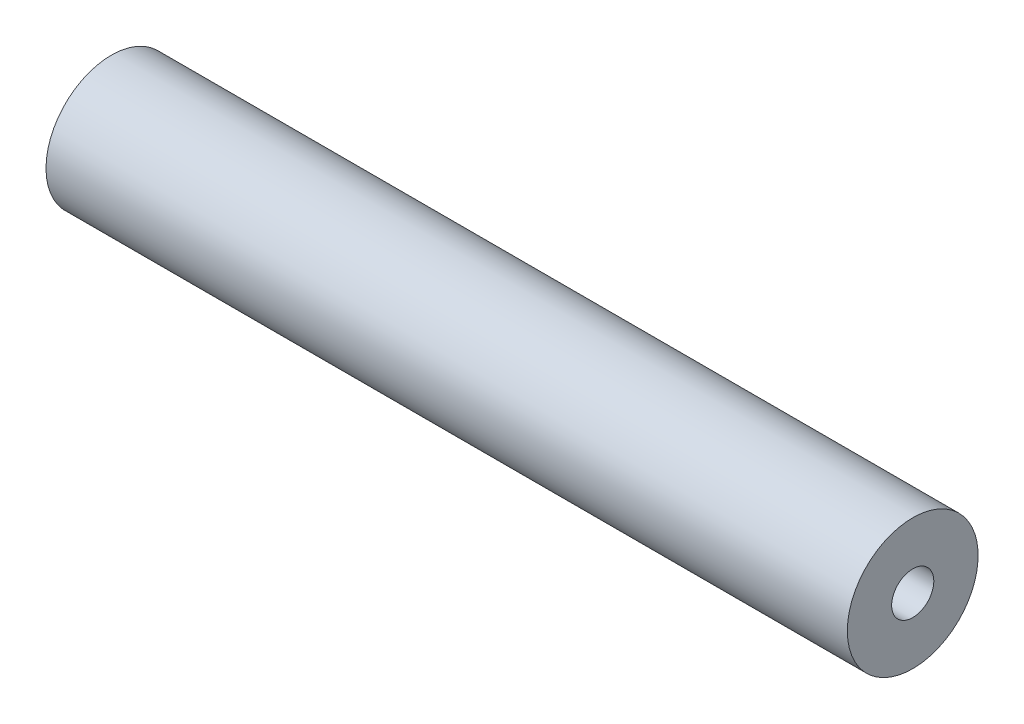
ISO-10303-21;
HEADER;
FILE_DESCRIPTION(('STEP AP214'),'2;1');
FILE_NAME('part.step','',(''),(''),'','','');
FILE_SCHEMA(('AUTOMOTIVE_DESIGN { 1 0 10303 214 1 1 1 1 }'));
ENDSEC;
DATA;
#1=APPLICATION_CONTEXT('core data for automotive mechanical design processes');
#2=APPLICATION_PROTOCOL_DEFINITION('international standard','automotive_design',2000,#1);
#3=PRODUCT_CONTEXT('',#1,'mechanical');
#4=PRODUCT('Part','Part','',(#3));
#5=PRODUCT_RELATED_PRODUCT_CATEGORY('part','',(#4));
#6=PRODUCT_DEFINITION_FORMATION('','',#4);
#7=PRODUCT_DEFINITION_CONTEXT('part definition',#1,'design');
#8=PRODUCT_DEFINITION('design','',#6,#7);
#9=PRODUCT_DEFINITION_SHAPE('','',#8);
#10=(LENGTH_UNIT() NAMED_UNIT(*) SI_UNIT(.MILLI.,.METRE.));
#11=(NAMED_UNIT(*) PLANE_ANGLE_UNIT() SI_UNIT($,.RADIAN.));
#12=(NAMED_UNIT(*) SI_UNIT($,.STERADIAN.) SOLID_ANGLE_UNIT());
#13=UNCERTAINTY_MEASURE_WITH_UNIT(LENGTH_MEASURE(1.E-05),#10,'distance_accuracy_value','');
#14=(GEOMETRIC_REPRESENTATION_CONTEXT(3) GLOBAL_UNCERTAINTY_ASSIGNED_CONTEXT((#13)) GLOBAL_UNIT_ASSIGNED_CONTEXT((#10,
#11,#12)) REPRESENTATION_CONTEXT('',''));
#15=CARTESIAN_POINT('',(0.,0.,0.));
#16=DIRECTION('',(0.,0.,1.));
#17=DIRECTION('',(1.,0.,0.));
#18=AXIS2_PLACEMENT_3D('',#15,#16,#17);
#19=CARTESIAN_POINT('',(153.,0.,0.));
#20=DIRECTION('',(-1.,0.,0.));
#21=DIRECTION('',(0.,0.,1.));
#22=AXIS2_PLACEMENT_3D('',#19,#20,#21);
#23=CYLINDRICAL_SURFACE('',#22,12.4054054054054);
#24=CARTESIAN_POINT('',(153.,0.,0.));
#25=DIRECTION('',(-1.,0.,0.));
#26=DIRECTION('',(0.,0.,1.));
#27=AXIS2_PLACEMENT_3D('',#24,#25,#26);
#28=CIRCLE('',#27,12.4054054054054);
#29=CARTESIAN_POINT('',(153.,0.,12.4054054054054));
#30=VERTEX_POINT('',#29);
#31=EDGE_CURVE('E10',#30,#30,#28,.T.);
#32=ORIENTED_EDGE('',*,*,#31,.T.);
#33=EDGE_LOOP('',(#32));
#34=FACE_BOUND('',#33,.T.);
#35=CARTESIAN_POINT('',(1.,0.,0.));
#36=DIRECTION('',(-1.,0.,0.));
#37=DIRECTION('',(0.,0.,1.));
#38=AXIS2_PLACEMENT_3D('',#35,#36,#37);
#39=CIRCLE('',#38,12.4054054054054);
#40=CARTESIAN_POINT('',(1.,0.,12.4054054054054));
#41=VERTEX_POINT('',#40);
#42=EDGE_CURVE('E46',#41,#41,#39,.T.);
#43=ORIENTED_EDGE('',*,*,#42,.F.);
#44=EDGE_LOOP('',(#43));
#45=FACE_BOUND('',#44,.T.);
#46=ADVANCED_FACE('F39',(#34,#45),#23,.T.);
#47=CARTESIAN_POINT('',(153.,12.4054054054054,0.));
#48=DIRECTION('',(1.,0.,0.));
#49=DIRECTION('',(0.,0.,-1.));
#50=AXIS2_PLACEMENT_3D('',#47,#48,#49);
#51=PLANE('',#50);
#52=CARTESIAN_POINT('',(153.,0.,0.));
#53=DIRECTION('',(1.,0.,0.));
#54=DIRECTION('',(0.,0.,-1.));
#55=AXIS2_PLACEMENT_3D('',#52,#53,#54);
#56=CIRCLE('',#55,4.);
#57=CARTESIAN_POINT('',(153.,0.,-4.));
#58=VERTEX_POINT('',#57);
#59=EDGE_CURVE('E56',#58,#58,#56,.T.);
#60=ORIENTED_EDGE('',*,*,#59,.F.);
#61=EDGE_LOOP('',(#60));
#62=FACE_BOUND('',#61,.T.);
#63=ORIENTED_EDGE('',*,*,#31,.F.);
#64=EDGE_LOOP('',(#63));
#65=FACE_BOUND('',#64,.T.);
#66=ADVANCED_FACE('F87',(#62,#65),#51,.T.);
#67=CARTESIAN_POINT('',(1.,0.,0.));
#68=DIRECTION('',(-1.,0.,0.));
#69=DIRECTION('',(0.,0.,1.));
#70=AXIS2_PLACEMENT_3D('',#67,#68,#69);
#71=PLANE('',#70);
#72=CARTESIAN_POINT('',(1.,0.,0.));
#73=DIRECTION('',(-1.,0.,0.));
#74=DIRECTION('',(0.,0.,1.));
#75=AXIS2_PLACEMENT_3D('',#72,#73,#74);
#76=CIRCLE('',#75,4.);
#77=CARTESIAN_POINT('',(1.,0.,4.));
#78=VERTEX_POINT('',#77);
#79=EDGE_CURVE('E63',#78,#78,#76,.T.);
#80=ORIENTED_EDGE('',*,*,#79,.F.);
#81=EDGE_LOOP('',(#80));
#82=FACE_BOUND('',#81,.T.);
#83=ORIENTED_EDGE('',*,*,#42,.T.);
#84=EDGE_LOOP('',(#83));
#85=FACE_BOUND('',#84,.T.);
#86=ADVANCED_FACE('F91',(#82,#85),#71,.T.);
#87=CARTESIAN_POINT('',(132.,0.,0.));
#88=DIRECTION('',(1.,0.,0.));
#89=DIRECTION('',(0.,0.,-1.));
#90=AXIS2_PLACEMENT_3D('',#87,#88,#89);
#91=CYLINDRICAL_SURFACE('',#90,4.);
#92=CARTESIAN_POINT('',(132.,0.,0.));
#93=DIRECTION('',(1.,0.,0.));
#94=DIRECTION('',(0.,0.,-1.));
#95=AXIS2_PLACEMENT_3D('',#92,#93,#94);
#96=CIRCLE('',#95,4.);
#97=CARTESIAN_POINT('',(132.,0.,-4.));
#98=VERTEX_POINT('',#97);
#99=EDGE_CURVE('E51',#98,#98,#96,.T.);
#100=CARTESIAN_POINT('',(132.,0.,-4.));
#101=CARTESIAN_POINT('',(132.21875,0.,-4.));
#102=CARTESIAN_POINT('',(132.4375,0.,-4.));
#103=CARTESIAN_POINT('',(132.875,0.,-4.));
#104=CARTESIAN_POINT('',(133.09375,0.,-4.));
#105=CARTESIAN_POINT('',(133.53125,0.,-4.));
#106=CARTESIAN_POINT('',(133.75,0.,-4.));
#107=CARTESIAN_POINT('',(134.1875,0.,-4.));
#108=CARTESIAN_POINT('',(134.40625,0.,-4.));
#109=CARTESIAN_POINT('',(134.84375,0.,-4.));
#110=CARTESIAN_POINT('',(135.0625,0.,-4.));
#111=CARTESIAN_POINT('',(135.5,0.,-4.));
#112=CARTESIAN_POINT('',(135.71875,0.,-4.));
#113=CARTESIAN_POINT('',(136.15625,0.,-4.));
#114=CARTESIAN_POINT('',(136.375,0.,-4.));
#115=CARTESIAN_POINT('',(136.8125,0.,-4.));
#116=CARTESIAN_POINT('',(137.03125,0.,-4.));
#117=CARTESIAN_POINT('',(137.46875,0.,-4.));
#118=CARTESIAN_POINT('',(137.6875,0.,-4.));
#119=CARTESIAN_POINT('',(138.125,0.,-4.));
#120=CARTESIAN_POINT('',(138.34375,0.,-4.));
#121=CARTESIAN_POINT('',(138.78125,0.,-4.));
#122=CARTESIAN_POINT('',(139.,0.,-4.));
#123=CARTESIAN_POINT('',(139.4375,0.,-4.));
#124=CARTESIAN_POINT('',(139.65625,0.,-4.));
#125=CARTESIAN_POINT('',(140.09375,0.,-4.));
#126=CARTESIAN_POINT('',(140.3125,0.,-4.));
#127=CARTESIAN_POINT('',(140.75,0.,-4.));
#128=CARTESIAN_POINT('',(140.96875,0.,-4.));
#129=CARTESIAN_POINT('',(141.40625,0.,-4.));
#130=CARTESIAN_POINT('',(141.625,0.,-4.));
#131=CARTESIAN_POINT('',(142.0625,0.,-4.));
#132=CARTESIAN_POINT('',(142.28125,0.,-4.));
#133=CARTESIAN_POINT('',(142.71875,0.,-4.));
#134=CARTESIAN_POINT('',(142.9375,0.,-4.));
#135=CARTESIAN_POINT('',(143.375,0.,-4.));
#136=CARTESIAN_POINT('',(143.59375,0.,-4.));
#137=CARTESIAN_POINT('',(144.03125,0.,-4.));
#138=CARTESIAN_POINT('',(144.25,0.,-4.));
#139=CARTESIAN_POINT('',(144.6875,0.,-4.));
#140=CARTESIAN_POINT('',(144.90625,0.,-4.));
#141=CARTESIAN_POINT('',(145.34375,0.,-4.));
#142=CARTESIAN_POINT('',(145.5625,0.,-4.));
#143=CARTESIAN_POINT('',(146.,0.,-4.));
#144=CARTESIAN_POINT('',(146.21875,0.,-4.));
#145=CARTESIAN_POINT('',(146.65625,0.,-4.));
#146=CARTESIAN_POINT('',(146.875,0.,-4.));
#147=CARTESIAN_POINT('',(147.3125,0.,-4.));
#148=CARTESIAN_POINT('',(147.53125,0.,-4.));
#149=CARTESIAN_POINT('',(147.96875,0.,-4.));
#150=CARTESIAN_POINT('',(148.1875,0.,-4.));
#151=CARTESIAN_POINT('',(148.625,0.,-4.));
#152=CARTESIAN_POINT('',(148.84375,0.,-4.));
#153=CARTESIAN_POINT('',(149.28125,0.,-4.));
#154=CARTESIAN_POINT('',(149.5,0.,-4.));
#155=CARTESIAN_POINT('',(149.9375,0.,-4.));
#156=CARTESIAN_POINT('',(150.15625,0.,-4.));
#157=CARTESIAN_POINT('',(150.59375,0.,-4.));
#158=CARTESIAN_POINT('',(150.8125,0.,-4.));
#159=CARTESIAN_POINT('',(151.25,0.,-4.));
#160=CARTESIAN_POINT('',(151.46875,0.,-4.));
#161=CARTESIAN_POINT('',(151.90625,0.,-4.));
#162=CARTESIAN_POINT('',(152.125,0.,-4.));
#163=CARTESIAN_POINT('',(152.5625,0.,-4.));
#164=CARTESIAN_POINT('',(152.78125,0.,-4.));
#165=CARTESIAN_POINT('',(153.,0.,-4.));
#166=B_SPLINE_CURVE_WITH_KNOTS('',3,(#100,#101,#102,#103,#104,#105,#106,#107,#108,#109,#110,
#111,#112,#113,#114,#115,#116,#117,#118,#119,#120,#121,#122,#123,#124,#125,#126,#127,#128,#129,
#130,#131,#132,#133,#134,#135,#136,#137,#138,#139,#140,#141,#142,#143,#144,#145,#146,#147,#148,
#149,#150,#151,#152,#153,#154,#155,#156,#157,#158,#159,#160,#161,#162,#163,#164,#165),
.UNSPECIFIED.,.F.,.F.,(4,2,2,2,2,2,2,2,2,2,2,2,2,2,2,2,2,2,2,2,2,2,2,2,2,2,2,2,2,2,2,2,4),(0.,
0.656249999999997,1.31249999999999,1.96874999999999,2.62499999999999,3.28124999999999,
3.93749999999998,4.59374999999998,5.24999999999998,5.90624999999997,6.56249999999997,7.21875,
7.87499999999999,8.53124999999999,9.18749999999999,9.84374999999998,10.5,11.15625,11.8125,
12.46875,13.125,13.78125,14.4375,15.09375,15.75,16.40625,17.0625,17.71875,18.375,19.03125,
19.6875,20.34375,21.),.UNSPECIFIED.);
#167=EDGE_CURVE('BSEAM83',#98,#58,#166,.T.);
#168=ORIENTED_EDGE('',*,*,#99,.F.);
#169=ORIENTED_EDGE('',*,*,#59,.T.);
#170=ORIENTED_EDGE('',*,*,#167,.T.);
#171=ORIENTED_EDGE('',*,*,#167,.F.);
#172=EDGE_LOOP('',(#168,#170,#169,#171));
#173=FACE_BOUND('',#172,.T.);
#174=ADVANCED_FACE('F83',(#173),#91,.F.);
#175=CARTESIAN_POINT('',(132.,0.,0.));
#176=DIRECTION('',(1.,0.,0.));
#177=DIRECTION('',(0.,0.,-1.));
#178=AXIS2_PLACEMENT_3D('',#175,#176,#177);
#179=PLANE('',#178);
#180=ORIENTED_EDGE('',*,*,#99,.T.);
#181=EDGE_LOOP('',(#180));
#182=FACE_BOUND('',#181,.T.);
#183=ADVANCED_FACE('F75',(#182),#179,.T.);
#184=CARTESIAN_POINT('',(22.,0.,0.));
#185=DIRECTION('',(-1.,0.,0.));
#186=DIRECTION('',(0.,0.,1.));
#187=AXIS2_PLACEMENT_3D('',#184,#185,#186);
#188=CYLINDRICAL_SURFACE('',#187,4.);
#189=CARTESIAN_POINT('',(22.,0.,0.));
#190=DIRECTION('',(-1.,0.,0.));
#191=DIRECTION('',(0.,0.,1.));
#192=AXIS2_PLACEMENT_3D('',#189,#190,#191);
#193=CIRCLE('',#192,4.);
#194=CARTESIAN_POINT('',(22.,0.,4.));
#195=VERTEX_POINT('',#194);
#196=EDGE_CURVE('E61',#195,#195,#193,.T.);
#197=CARTESIAN_POINT('',(1.,0.,4.));
#198=CARTESIAN_POINT('',(1.21875,0.,4.));
#199=CARTESIAN_POINT('',(1.4375,0.,4.));
#200=CARTESIAN_POINT('',(1.875,0.,4.));
#201=CARTESIAN_POINT('',(2.09375,0.,4.));
#202=CARTESIAN_POINT('',(2.53125,0.,4.));
#203=CARTESIAN_POINT('',(2.75,0.,4.));
#204=CARTESIAN_POINT('',(3.1875,0.,4.));
#205=CARTESIAN_POINT('',(3.40625,0.,4.));
#206=CARTESIAN_POINT('',(3.84375,0.,4.));
#207=CARTESIAN_POINT('',(4.0625,0.,4.));
#208=CARTESIAN_POINT('',(4.5,0.,4.));
#209=CARTESIAN_POINT('',(4.71875,0.,4.));
#210=CARTESIAN_POINT('',(5.15625,0.,4.));
#211=CARTESIAN_POINT('',(5.375,0.,4.));
#212=CARTESIAN_POINT('',(5.8125,0.,4.));
#213=CARTESIAN_POINT('',(6.03125,0.,4.));
#214=CARTESIAN_POINT('',(6.46875,0.,4.));
#215=CARTESIAN_POINT('',(6.6875,0.,4.));
#216=CARTESIAN_POINT('',(7.125,0.,4.));
#217=CARTESIAN_POINT('',(7.34375,0.,4.));
#218=CARTESIAN_POINT('',(7.78125,0.,4.));
#219=CARTESIAN_POINT('',(8.,0.,4.));
#220=CARTESIAN_POINT('',(8.4375,0.,4.));
#221=CARTESIAN_POINT('',(8.65625,0.,4.));
#222=CARTESIAN_POINT('',(9.09375,0.,4.));
#223=CARTESIAN_POINT('',(9.3125,0.,4.));
#224=CARTESIAN_POINT('',(9.75,0.,4.));
#225=CARTESIAN_POINT('',(9.96875,0.,4.));
#226=CARTESIAN_POINT('',(10.40625,0.,4.));
#227=CARTESIAN_POINT('',(10.625,0.,4.));
#228=CARTESIAN_POINT('',(11.0625,0.,4.));
#229=CARTESIAN_POINT('',(11.28125,0.,4.));
#230=CARTESIAN_POINT('',(11.71875,0.,4.));
#231=CARTESIAN_POINT('',(11.9375,0.,4.));
#232=CARTESIAN_POINT('',(12.375,0.,4.));
#233=CARTESIAN_POINT('',(12.59375,0.,4.));
#234=CARTESIAN_POINT('',(13.03125,0.,4.));
#235=CARTESIAN_POINT('',(13.25,0.,4.));
#236=CARTESIAN_POINT('',(13.6875,0.,4.));
#237=CARTESIAN_POINT('',(13.90625,0.,4.));
#238=CARTESIAN_POINT('',(14.34375,0.,4.));
#239=CARTESIAN_POINT('',(14.5625,0.,4.));
#240=CARTESIAN_POINT('',(15.,0.,4.));
#241=CARTESIAN_POINT('',(15.21875,0.,4.));
#242=CARTESIAN_POINT('',(15.65625,0.,4.));
#243=CARTESIAN_POINT('',(15.875,0.,4.));
#244=CARTESIAN_POINT('',(16.3125,0.,4.));
#245=CARTESIAN_POINT('',(16.53125,0.,4.));
#246=CARTESIAN_POINT('',(16.96875,0.,4.));
#247=CARTESIAN_POINT('',(17.1875,0.,4.));
#248=CARTESIAN_POINT('',(17.625,0.,4.));
#249=CARTESIAN_POINT('',(17.84375,0.,4.));
#250=CARTESIAN_POINT('',(18.28125,0.,4.));
#251=CARTESIAN_POINT('',(18.5,0.,4.));
#252=CARTESIAN_POINT('',(18.9375,0.,4.));
#253=CARTESIAN_POINT('',(19.15625,0.,4.));
#254=CARTESIAN_POINT('',(19.59375,0.,4.));
#255=CARTESIAN_POINT('',(19.8125,0.,4.));
#256=CARTESIAN_POINT('',(20.25,0.,4.));
#257=CARTESIAN_POINT('',(20.46875,0.,4.));
#258=CARTESIAN_POINT('',(20.90625,0.,4.));
#259=CARTESIAN_POINT('',(21.125,0.,4.));
#260=CARTESIAN_POINT('',(21.5625,0.,4.));
#261=CARTESIAN_POINT('',(21.78125,0.,4.));
#262=CARTESIAN_POINT('',(22.,0.,4.));
#263=B_SPLINE_CURVE_WITH_KNOTS('',3,(#197,#198,#199,#200,#201,#202,#203,#204,#205,#206,#207,
#208,#209,#210,#211,#212,#213,#214,#215,#216,#217,#218,#219,#220,#221,#222,#223,#224,#225,#226,
#227,#228,#229,#230,#231,#232,#233,#234,#235,#236,#237,#238,#239,#240,#241,#242,#243,#244,#245,
#246,#247,#248,#249,#250,#251,#252,#253,#254,#255,#256,#257,#258,#259,#260,#261,#262),
.UNSPECIFIED.,.F.,.F.,(4,2,2,2,2,2,2,2,2,2,2,2,2,2,2,2,2,2,2,2,2,2,2,2,2,2,2,2,2,2,2,2,4),(0.,
0.656250000000001,1.3125,1.96875,2.625,3.28125,3.9375,4.59375,5.25,5.90625,6.5625,7.21875,7.875,
8.53125,9.1875,9.84375,10.5,11.15625,11.8125,12.46875,13.125,13.78125,14.4375,15.09375,15.75,
16.40625,17.0625,17.71875,18.375,19.03125,19.6875,20.34375,21.),.UNSPECIFIED.);
#264=EDGE_CURVE('BSEAM73',#78,#195,#263,.T.);
#265=ORIENTED_EDGE('',*,*,#79,.T.);
#266=ORIENTED_EDGE('',*,*,#196,.F.);
#267=ORIENTED_EDGE('',*,*,#264,.T.);
#268=ORIENTED_EDGE('',*,*,#264,.F.);
#269=EDGE_LOOP('',(#265,#267,#266,#268));
#270=FACE_BOUND('',#269,.T.);
#271=ADVANCED_FACE('F73',(#270),#188,.F.);
#272=CARTESIAN_POINT('',(22.,0.,0.));
#273=DIRECTION('',(-1.,0.,0.));
#274=DIRECTION('',(0.,0.,1.));
#275=AXIS2_PLACEMENT_3D('',#272,#273,#274);
#276=PLANE('',#275);
#277=ORIENTED_EDGE('',*,*,#196,.T.);
#278=EDGE_LOOP('',(#277));
#279=FACE_BOUND('',#278,.T.);
#280=ADVANCED_FACE('F71',(#279),#276,.T.);
#281=CLOSED_SHELL('',(#46,#66,#86,#174,#183,#271,#280));
#282=MANIFOLD_SOLID_BREP('B2',#281);
#283=ADVANCED_BREP_SHAPE_REPRESENTATION('',(#18,#282),#14);
#284=SHAPE_DEFINITION_REPRESENTATION(#9,#283);
ENDSEC;
END-ISO-10303-21;
